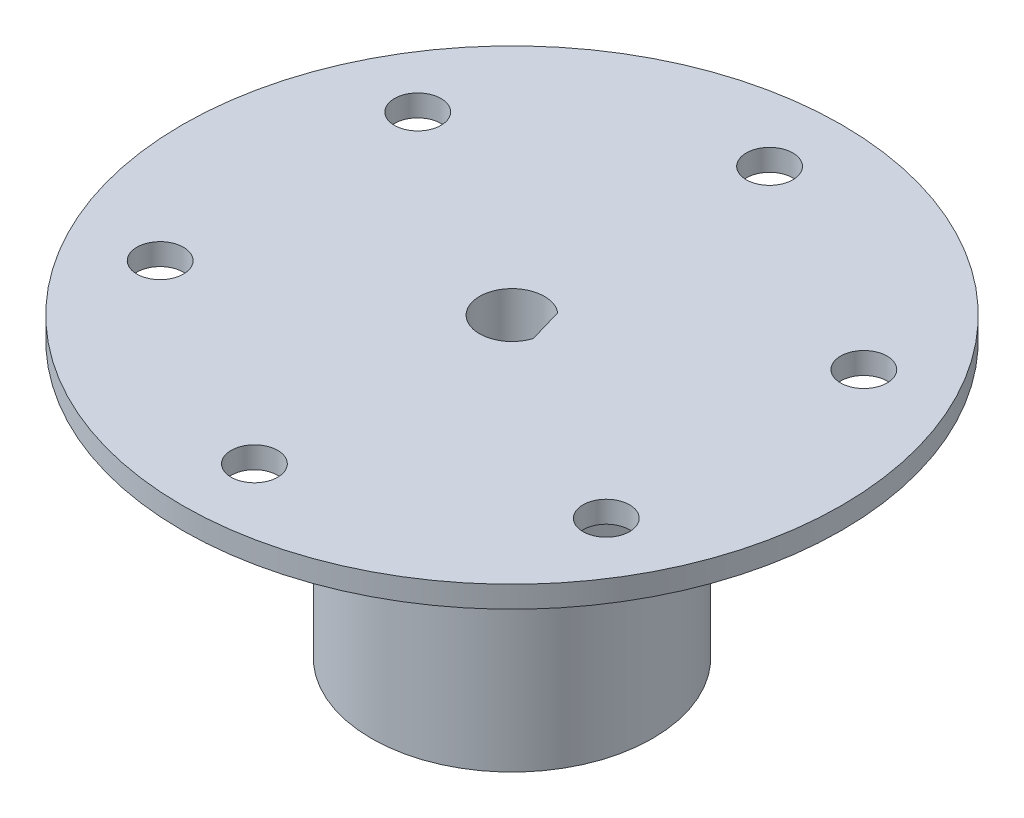
ISO-10303-21;
HEADER;
FILE_DESCRIPTION(('STEP AP214'),'2;1');
FILE_NAME('part.step','',(''),(''),'','','');
FILE_SCHEMA(('AUTOMOTIVE_DESIGN { 1 0 10303 214 1 1 1 1 }'));
ENDSEC;
DATA;
#1=APPLICATION_CONTEXT('core data for automotive mechanical design processes');
#2=APPLICATION_PROTOCOL_DEFINITION('international standard','automotive_design',2000,#1);
#3=PRODUCT_CONTEXT('',#1,'mechanical');
#4=PRODUCT('Part','Part','',(#3));
#5=PRODUCT_RELATED_PRODUCT_CATEGORY('part','',(#4));
#6=PRODUCT_DEFINITION_FORMATION('','',#4);
#7=PRODUCT_DEFINITION_CONTEXT('part definition',#1,'design');
#8=PRODUCT_DEFINITION('design','',#6,#7);
#9=PRODUCT_DEFINITION_SHAPE('','',#8);
#10=(LENGTH_UNIT() NAMED_UNIT(*) SI_UNIT(.MILLI.,.METRE.));
#11=(NAMED_UNIT(*) PLANE_ANGLE_UNIT() SI_UNIT($,.RADIAN.));
#12=(NAMED_UNIT(*) SI_UNIT($,.STERADIAN.) SOLID_ANGLE_UNIT());
#13=UNCERTAINTY_MEASURE_WITH_UNIT(LENGTH_MEASURE(1.E-05),#10,'distance_accuracy_value','');
#14=(GEOMETRIC_REPRESENTATION_CONTEXT(3) GLOBAL_UNCERTAINTY_ASSIGNED_CONTEXT((#13)) GLOBAL_UNIT_ASSIGNED_CONTEXT((#10,
#11,#12)) REPRESENTATION_CONTEXT('',''));
#15=CARTESIAN_POINT('',(0.,0.,0.));
#16=DIRECTION('',(0.,0.,1.));
#17=DIRECTION('',(1.,0.,0.));
#18=AXIS2_PLACEMENT_3D('',#15,#16,#17);
#19=CARTESIAN_POINT('',(0.,0.,0.));
#20=DIRECTION('',(0.,1.,0.));
#21=DIRECTION('',(0.,0.,1.));
#22=AXIS2_PLACEMENT_3D('',#19,#20,#21);
#23=PLANE('',#22);
#24=CARTESIAN_POINT('',(-20.6222299276169,0.,11.90625));
#25=DIRECTION('',(0.,1.,0.));
#26=DIRECTION('',(0.,0.,1.));
#27=AXIS2_PLACEMENT_3D('',#24,#25,#26);
#28=CIRCLE('',#27,2.15265);
#29=CARTESIAN_POINT('',(-20.6222299276169,0.,14.0589));
#30=VERTEX_POINT('',#29);
#31=EDGE_CURVE('E84',#30,#30,#28,.T.);
#32=ORIENTED_EDGE('',*,*,#31,.T.);
#33=EDGE_LOOP('',(#32));
#34=FACE_BOUND('',#33,.T.);
#35=CARTESIAN_POINT('',(-20.6222299276169,0.,-11.90625));
#36=DIRECTION('',(0.,1.,0.));
#37=DIRECTION('',(0.,0.,1.));
#38=AXIS2_PLACEMENT_3D('',#35,#36,#37);
#39=CIRCLE('',#38,2.15265);
#40=CARTESIAN_POINT('',(-20.6222299276169,0.,-9.7536));
#41=VERTEX_POINT('',#40);
#42=EDGE_CURVE('E89',#41,#41,#39,.T.);
#43=ORIENTED_EDGE('',*,*,#42,.T.);
#44=EDGE_LOOP('',(#43));
#45=FACE_BOUND('',#44,.T.);
#46=CARTESIAN_POINT('',(0.,0.,-23.8125));
#47=DIRECTION('',(0.,1.,0.));
#48=DIRECTION('',(0.,0.,1.));
#49=AXIS2_PLACEMENT_3D('',#46,#47,#48);
#50=CIRCLE('',#49,2.15265);
#51=CARTESIAN_POINT('',(0.,0.,-21.65985));
#52=VERTEX_POINT('',#51);
#53=EDGE_CURVE('E95',#52,#52,#50,.T.);
#54=ORIENTED_EDGE('',*,*,#53,.T.);
#55=EDGE_LOOP('',(#54));
#56=FACE_BOUND('',#55,.T.);
#57=CARTESIAN_POINT('',(20.6222299276168,0.,-11.9062500000002));
#58=DIRECTION('',(0.,1.,0.));
#59=DIRECTION('',(0.,0.,1.));
#60=AXIS2_PLACEMENT_3D('',#57,#58,#59);
#61=CIRCLE('',#60,2.15265);
#62=CARTESIAN_POINT('',(20.6222299276168,0.,-9.75360000000024));
#63=VERTEX_POINT('',#62);
#64=EDGE_CURVE('E101',#63,#63,#61,.T.);
#65=ORIENTED_EDGE('',*,*,#64,.T.);
#66=EDGE_LOOP('',(#65));
#67=FACE_BOUND('',#66,.T.);
#68=CARTESIAN_POINT('',(20.622229927617,0.,11.9062499999998));
#69=DIRECTION('',(0.,1.,0.));
#70=DIRECTION('',(0.,0.,1.));
#71=AXIS2_PLACEMENT_3D('',#68,#69,#70);
#72=CIRCLE('',#71,2.15265);
#73=CARTESIAN_POINT('',(20.622229927617,0.,14.0588999999998));
#74=VERTEX_POINT('',#73);
#75=EDGE_CURVE('E107',#74,#74,#72,.T.);
#76=ORIENTED_EDGE('',*,*,#75,.T.);
#77=EDGE_LOOP('',(#76));
#78=FACE_BOUND('',#77,.T.);
#79=CARTESIAN_POINT('',(0.,0.,23.8125));
#80=DIRECTION('',(0.,1.,0.));
#81=DIRECTION('',(0.,0.,1.));
#82=AXIS2_PLACEMENT_3D('',#79,#80,#81);
#83=CIRCLE('',#82,2.15265);
#84=CARTESIAN_POINT('',(0.,0.,25.96515));
#85=VERTEX_POINT('',#84);
#86=EDGE_CURVE('E113',#85,#85,#83,.T.);
#87=ORIENTED_EDGE('',*,*,#86,.T.);
#88=EDGE_LOOP('',(#87));
#89=FACE_BOUND('',#88,.T.);
#90=CARTESIAN_POINT('',(0.,0.,0.));
#91=DIRECTION('',(0.,1.,0.));
#92=DIRECTION('',(0.,0.,1.));
#93=AXIS2_PLACEMENT_3D('',#90,#91,#92);
#94=CIRCLE('',#93,30.48);
#95=CARTESIAN_POINT('',(0.,0.,30.48));
#96=VERTEX_POINT('',#95);
#97=EDGE_CURVE('E119',#96,#96,#94,.T.);
#98=ORIENTED_EDGE('',*,*,#97,.F.);
#99=EDGE_LOOP('',(#98));
#100=FACE_BOUND('',#99,.T.);
#101=CARTESIAN_POINT('',(0.,0.,0.));
#102=DIRECTION('',(0.,1.,0.));
#103=DIRECTION('',(0.,0.,1.));
#104=AXIS2_PLACEMENT_3D('',#101,#102,#103);
#105=CIRCLE('',#104,13.);
#106=CARTESIAN_POINT('',(0.,0.,13.));
#107=VERTEX_POINT('',#106);
#108=EDGE_CURVE('E11',#107,#107,#105,.F.);
#109=ORIENTED_EDGE('',*,*,#108,.F.);
#110=EDGE_LOOP('',(#109));
#111=FACE_BOUND('',#110,.T.);
#112=ADVANCED_FACE('F37',(#34,#45,#56,#67,#78,#89,#100,#111),#23,.F.);
#113=CARTESIAN_POINT('',(0.,2.,0.));
#114=DIRECTION('',(0.,1.,0.));
#115=DIRECTION('',(0.,0.,1.));
#116=AXIS2_PLACEMENT_3D('',#113,#114,#115);
#117=PLANE('',#116);
#118=DIRECTION('',(-0.280870271353728,0.,-0.95974574272027));
#119=VECTOR('',#118,1.);
#120=CARTESIAN_POINT('',(2.39828920067989,2.,-0.701861033184085));
#121=LINE('',#120,#119);
#122=CARTESIAN_POINT('',(2.86453385112708,2.,0.891316899731563));
#123=VERTEX_POINT('',#122);
#124=CARTESIAN_POINT('',(1.9320445502327,2.,-2.29503896609973));
#125=VERTEX_POINT('',#124);
#126=EDGE_CURVE('E52',#123,#125,#121,.T.);
#127=ORIENTED_EDGE('',*,*,#126,.F.);
#128=CARTESIAN_POINT('',(0.,2.,0.));
#129=DIRECTION('',(0.,1.,0.));
#130=DIRECTION('',(0.,0.,1.));
#131=AXIS2_PLACEMENT_3D('',#128,#129,#130);
#132=CIRCLE('',#131,3.);
#133=EDGE_CURVE('E69',#125,#123,#132,.T.);
#134=ORIENTED_EDGE('',*,*,#133,.F.);
#135=EDGE_LOOP('',(#127,#134));
#136=FACE_BOUND('',#135,.T.);
#137=CARTESIAN_POINT('',(-20.6222299276169,2.,-11.90625));
#138=DIRECTION('',(0.,1.,0.));
#139=DIRECTION('',(0.,0.,1.));
#140=AXIS2_PLACEMENT_3D('',#137,#138,#139);
#141=CIRCLE('',#140,2.15265);
#142=CARTESIAN_POINT('',(-20.6222299276169,2.,-9.7536));
#143=VERTEX_POINT('',#142);
#144=EDGE_CURVE('E92',#143,#143,#141,.T.);
#145=ORIENTED_EDGE('',*,*,#144,.F.);
#146=EDGE_LOOP('',(#145));
#147=FACE_BOUND('',#146,.T.);
#148=CARTESIAN_POINT('',(20.6222299276168,2.,-11.9062500000002));
#149=DIRECTION('',(0.,1.,0.));
#150=DIRECTION('',(0.,0.,1.));
#151=AXIS2_PLACEMENT_3D('',#148,#149,#150);
#152=CIRCLE('',#151,2.15265);
#153=CARTESIAN_POINT('',(20.6222299276168,2.,-9.75360000000024));
#154=VERTEX_POINT('',#153);
#155=EDGE_CURVE('E104',#154,#154,#152,.T.);
#156=ORIENTED_EDGE('',*,*,#155,.F.);
#157=EDGE_LOOP('',(#156));
#158=FACE_BOUND('',#157,.T.);
#159=CARTESIAN_POINT('',(0.,2.,23.8125));
#160=DIRECTION('',(0.,1.,0.));
#161=DIRECTION('',(0.,0.,1.));
#162=AXIS2_PLACEMENT_3D('',#159,#160,#161);
#163=CIRCLE('',#162,2.15265);
#164=CARTESIAN_POINT('',(0.,2.,25.96515));
#165=VERTEX_POINT('',#164);
#166=EDGE_CURVE('E116',#165,#165,#163,.T.);
#167=ORIENTED_EDGE('',*,*,#166,.F.);
#168=EDGE_LOOP('',(#167));
#169=FACE_BOUND('',#168,.T.);
#170=CARTESIAN_POINT('',(0.,2.,0.));
#171=DIRECTION('',(0.,1.,0.));
#172=DIRECTION('',(0.,0.,1.));
#173=AXIS2_PLACEMENT_3D('',#170,#171,#172);
#174=CIRCLE('',#173,30.48);
#175=CARTESIAN_POINT('',(0.,2.,30.48));
#176=VERTEX_POINT('',#175);
#177=EDGE_CURVE('E45',#176,#176,#174,.T.);
#178=ORIENTED_EDGE('',*,*,#177,.T.);
#179=EDGE_LOOP('',(#178));
#180=FACE_BOUND('',#179,.T.);
#181=CARTESIAN_POINT('',(20.622229927617,2.,11.9062499999998));
#182=DIRECTION('',(0.,1.,0.));
#183=DIRECTION('',(0.,0.,1.));
#184=AXIS2_PLACEMENT_3D('',#181,#182,#183);
#185=CIRCLE('',#184,2.15265);
#186=CARTESIAN_POINT('',(20.622229927617,2.,14.0588999999998));
#187=VERTEX_POINT('',#186);
#188=EDGE_CURVE('E110',#187,#187,#185,.T.);
#189=ORIENTED_EDGE('',*,*,#188,.F.);
#190=EDGE_LOOP('',(#189));
#191=FACE_BOUND('',#190,.T.);
#192=CARTESIAN_POINT('',(0.,2.,-23.8125));
#193=DIRECTION('',(0.,1.,0.));
#194=DIRECTION('',(0.,0.,1.));
#195=AXIS2_PLACEMENT_3D('',#192,#193,#194);
#196=CIRCLE('',#195,2.15265);
#197=CARTESIAN_POINT('',(0.,2.,-21.65985));
#198=VERTEX_POINT('',#197);
#199=EDGE_CURVE('E98',#198,#198,#196,.T.);
#200=ORIENTED_EDGE('',*,*,#199,.F.);
#201=EDGE_LOOP('',(#200));
#202=FACE_BOUND('',#201,.T.);
#203=CARTESIAN_POINT('',(-20.6222299276169,2.,11.90625));
#204=DIRECTION('',(0.,1.,0.));
#205=DIRECTION('',(0.,0.,1.));
#206=AXIS2_PLACEMENT_3D('',#203,#204,#205);
#207=CIRCLE('',#206,2.15265);
#208=CARTESIAN_POINT('',(-20.6222299276169,2.,14.0589));
#209=VERTEX_POINT('',#208);
#210=EDGE_CURVE('E86',#209,#209,#207,.T.);
#211=ORIENTED_EDGE('',*,*,#210,.F.);
#212=EDGE_LOOP('',(#211));
#213=FACE_BOUND('',#212,.T.);
#214=ADVANCED_FACE('F129',(#136,#147,#158,#169,#180,#191,#202,#213),#117,.T.);
#215=CARTESIAN_POINT('',(0.,2.,0.));
#216=DIRECTION('',(0.,-1.,0.));
#217=DIRECTION('',(0.,0.,-1.));
#218=AXIS2_PLACEMENT_3D('',#215,#216,#217);
#219=CYLINDRICAL_SURFACE('',#218,30.48);
#220=ORIENTED_EDGE('',*,*,#177,.F.);
#221=EDGE_LOOP('',(#220));
#222=FACE_BOUND('',#221,.T.);
#223=ORIENTED_EDGE('',*,*,#97,.T.);
#224=EDGE_LOOP('',(#223));
#225=FACE_BOUND('',#224,.T.);
#226=ADVANCED_FACE('F39',(#222,#225),#219,.T.);
#227=CARTESIAN_POINT('',(0.,2.,23.8125));
#228=DIRECTION('',(0.,-1.,0.));
#229=DIRECTION('',(0.,0.,-1.));
#230=AXIS2_PLACEMENT_3D('',#227,#228,#229);
#231=CYLINDRICAL_SURFACE('',#230,2.15265);
#232=ORIENTED_EDGE('',*,*,#166,.T.);
#233=EDGE_LOOP('',(#232));
#234=FACE_BOUND('',#233,.T.);
#235=ORIENTED_EDGE('',*,*,#86,.F.);
#236=EDGE_LOOP('',(#235));
#237=FACE_BOUND('',#236,.T.);
#238=ADVANCED_FACE('F167',(#234,#237),#231,.F.);
#239=CARTESIAN_POINT('',(20.622229927617,2.,11.9062499999998));
#240=DIRECTION('',(0.,-1.,0.));
#241=DIRECTION('',(0.,0.,-1.));
#242=AXIS2_PLACEMENT_3D('',#239,#240,#241);
#243=CYLINDRICAL_SURFACE('',#242,2.15265);
#244=ORIENTED_EDGE('',*,*,#188,.T.);
#245=EDGE_LOOP('',(#244));
#246=FACE_BOUND('',#245,.T.);
#247=ORIENTED_EDGE('',*,*,#75,.F.);
#248=EDGE_LOOP('',(#247));
#249=FACE_BOUND('',#248,.T.);
#250=ADVANCED_FACE('F163',(#246,#249),#243,.F.);
#251=CARTESIAN_POINT('',(20.6222299276168,2.,-11.9062500000002));
#252=DIRECTION('',(0.,-1.,0.));
#253=DIRECTION('',(0.,0.,-1.));
#254=AXIS2_PLACEMENT_3D('',#251,#252,#253);
#255=CYLINDRICAL_SURFACE('',#254,2.15265);
#256=ORIENTED_EDGE('',*,*,#155,.T.);
#257=EDGE_LOOP('',(#256));
#258=FACE_BOUND('',#257,.T.);
#259=ORIENTED_EDGE('',*,*,#64,.F.);
#260=EDGE_LOOP('',(#259));
#261=FACE_BOUND('',#260,.T.);
#262=ADVANCED_FACE('F159',(#258,#261),#255,.F.);
#263=CARTESIAN_POINT('',(0.,2.,-23.8125));
#264=DIRECTION('',(0.,-1.,0.));
#265=DIRECTION('',(0.,0.,-1.));
#266=AXIS2_PLACEMENT_3D('',#263,#264,#265);
#267=CYLINDRICAL_SURFACE('',#266,2.15265);
#268=ORIENTED_EDGE('',*,*,#199,.T.);
#269=EDGE_LOOP('',(#268));
#270=FACE_BOUND('',#269,.T.);
#271=ORIENTED_EDGE('',*,*,#53,.F.);
#272=EDGE_LOOP('',(#271));
#273=FACE_BOUND('',#272,.T.);
#274=ADVANCED_FACE('F155',(#270,#273),#267,.F.);
#275=CARTESIAN_POINT('',(-20.6222299276169,2.,-11.90625));
#276=DIRECTION('',(0.,-1.,0.));
#277=DIRECTION('',(0.,0.,-1.));
#278=AXIS2_PLACEMENT_3D('',#275,#276,#277);
#279=CYLINDRICAL_SURFACE('',#278,2.15265);
#280=ORIENTED_EDGE('',*,*,#144,.T.);
#281=EDGE_LOOP('',(#280));
#282=FACE_BOUND('',#281,.T.);
#283=ORIENTED_EDGE('',*,*,#42,.F.);
#284=EDGE_LOOP('',(#283));
#285=FACE_BOUND('',#284,.T.);
#286=ADVANCED_FACE('F151',(#282,#285),#279,.F.);
#287=CARTESIAN_POINT('',(-20.6222299276169,2.,11.90625));
#288=DIRECTION('',(0.,-1.,0.));
#289=DIRECTION('',(0.,0.,-1.));
#290=AXIS2_PLACEMENT_3D('',#287,#288,#289);
#291=CYLINDRICAL_SURFACE('',#290,2.15265);
#292=ORIENTED_EDGE('',*,*,#210,.T.);
#293=EDGE_LOOP('',(#292));
#294=FACE_BOUND('',#293,.T.);
#295=ORIENTED_EDGE('',*,*,#31,.F.);
#296=EDGE_LOOP('',(#295));
#297=FACE_BOUND('',#296,.T.);
#298=ADVANCED_FACE('F148',(#294,#297),#291,.F.);
#299=CARTESIAN_POINT('',(2.39828920067989,-8.,-0.701861033184085));
#300=DIRECTION('',(0.95974574272027,0.,-0.280870271353728));
#301=DIRECTION('',(-0.280870271353728,0.,-0.95974574272027));
#302=AXIS2_PLACEMENT_3D('',#299,#300,#301);
#303=PLANE('',#302);
#304=DIRECTION('',(0.,1.,0.));
#305=VECTOR('',#304,1.);
#306=CARTESIAN_POINT('',(2.86453385112708,-8.,0.891316899731563));
#307=LINE('',#306,#305);
#308=CARTESIAN_POINT('',(2.86453385112708,-25.4,0.891316899731563));
#309=VERTEX_POINT('',#308);
#310=EDGE_CURVE('E57',#309,#123,#307,.T.);
#311=ORIENTED_EDGE('',*,*,#310,.T.);
#312=ORIENTED_EDGE('',*,*,#126,.T.);
#313=DIRECTION('',(0.,1.,0.));
#314=VECTOR('',#313,1.);
#315=CARTESIAN_POINT('',(1.9320445502327,-8.,-2.29503896609973));
#316=LINE('',#315,#314);
#317=CARTESIAN_POINT('',(1.9320445502327,-25.4,-2.29503896609973));
#318=VERTEX_POINT('',#317);
#319=EDGE_CURVE('E62',#318,#125,#316,.T.);
#320=ORIENTED_EDGE('',*,*,#319,.F.);
#321=DIRECTION('',(-0.280870271353728,0.,-0.95974574272027));
#322=VECTOR('',#321,1.);
#323=CARTESIAN_POINT('',(2.39828920067989,-25.4,-0.701861033184085));
#324=LINE('',#323,#322);
#325=EDGE_CURVE('E66',#309,#318,#324,.T.);
#326=ORIENTED_EDGE('',*,*,#325,.F.);
#327=EDGE_LOOP('',(#311,#312,#320,#326));
#328=FACE_BOUND('',#327,.T.);
#329=ADVANCED_FACE('F64',(#328),#303,.F.);
#330=CARTESIAN_POINT('',(0.,-8.,0.));
#331=DIRECTION('',(0.,1.,0.));
#332=DIRECTION('',(0.,0.,1.));
#333=AXIS2_PLACEMENT_3D('',#330,#331,#332);
#334=CYLINDRICAL_SURFACE('',#333,3.);
#335=ORIENTED_EDGE('',*,*,#319,.T.);
#336=ORIENTED_EDGE('',*,*,#133,.T.);
#337=ORIENTED_EDGE('',*,*,#310,.F.);
#338=CARTESIAN_POINT('',(0.,-25.4,0.));
#339=DIRECTION('',(0.,-1.,0.));
#340=DIRECTION('',(0.,0.,-1.));
#341=AXIS2_PLACEMENT_3D('',#338,#339,#340);
#342=CIRCLE('',#341,3.);
#343=EDGE_CURVE('E72',#318,#309,#342,.F.);
#344=ORIENTED_EDGE('',*,*,#343,.F.);
#345=EDGE_LOOP('',(#335,#336,#337,#344));
#346=FACE_BOUND('',#345,.T.);
#347=ADVANCED_FACE('F73',(#346),#334,.F.);
#348=CARTESIAN_POINT('',(0.,-25.4,0.));
#349=DIRECTION('',(0.,1.,0.));
#350=DIRECTION('',(0.,0.,1.));
#351=AXIS2_PLACEMENT_3D('',#348,#349,#350);
#352=CYLINDRICAL_SURFACE('',#351,13.);
#353=CARTESIAN_POINT('',(0.,-25.4,0.));
#354=DIRECTION('',(0.,-1.,0.));
#355=DIRECTION('',(0.,0.,-1.));
#356=AXIS2_PLACEMENT_3D('',#353,#354,#355);
#357=CIRCLE('',#356,13.);
#358=CARTESIAN_POINT('',(0.,-25.4,-13.));
#359=VERTEX_POINT('',#358);
#360=EDGE_CURVE('E77',#359,#359,#357,.T.);
#361=ORIENTED_EDGE('',*,*,#360,.F.);
#362=EDGE_LOOP('',(#361));
#363=FACE_BOUND('',#362,.T.);
#364=ORIENTED_EDGE('',*,*,#108,.T.);
#365=EDGE_LOOP('',(#364));
#366=FACE_BOUND('',#365,.T.);
#367=ADVANCED_FACE('F133',(#363,#366),#352,.T.);
#368=CARTESIAN_POINT('',(0.,-25.4,0.));
#369=DIRECTION('',(0.,-1.,0.));
#370=DIRECTION('',(0.,0.,-1.));
#371=AXIS2_PLACEMENT_3D('',#368,#369,#370);
#372=PLANE('',#371);
#373=ORIENTED_EDGE('',*,*,#360,.T.);
#374=EDGE_LOOP('',(#373));
#375=FACE_BOUND('',#374,.T.);
#376=ORIENTED_EDGE('',*,*,#325,.T.);
#377=ORIENTED_EDGE('',*,*,#343,.T.);
#378=EDGE_LOOP('',(#376,#377));
#379=FACE_BOUND('',#378,.T.);
#380=ADVANCED_FACE('F76',(#375,#379),#372,.T.);
#381=CLOSED_SHELL('',(#112,#214,#226,#238,#250,#262,#274,#286,#298,#329,#347,#367,#380));
#382=MANIFOLD_SOLID_BREP('B2',#381);
#383=ADVANCED_BREP_SHAPE_REPRESENTATION('',(#18,#382),#14);
#384=SHAPE_DEFINITION_REPRESENTATION(#9,#383);
ENDSEC;
END-ISO-10303-21;
